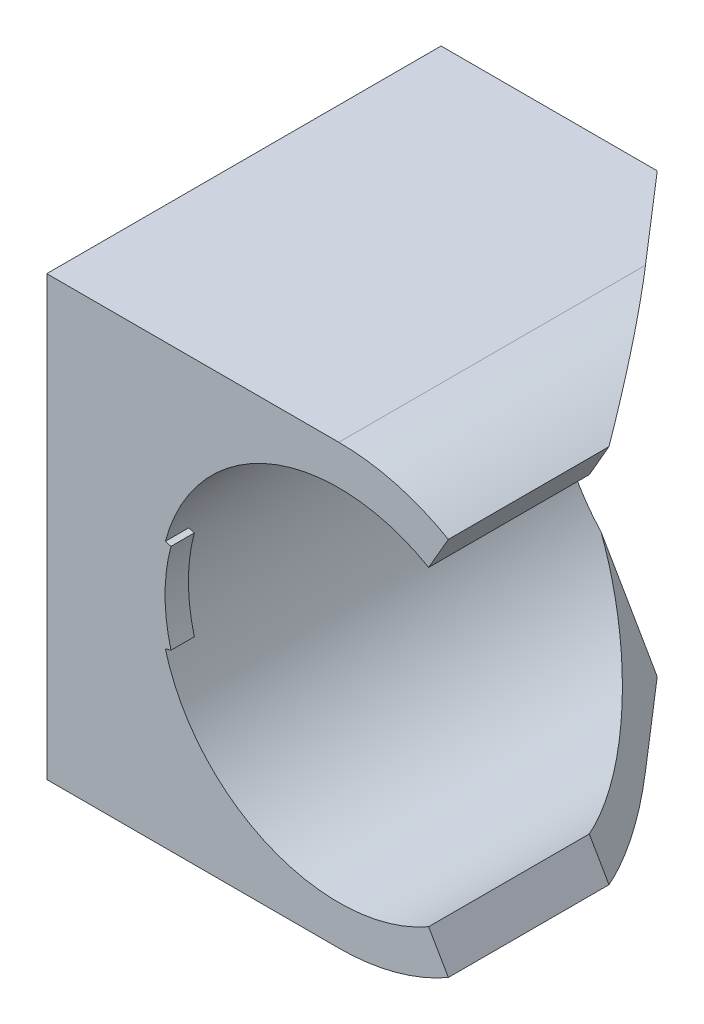
ISO-10303-21;
HEADER;
FILE_DESCRIPTION(('STEP AP214'),'2;1');
FILE_NAME('part.step','',(''),(''),'','','');
FILE_SCHEMA(('AUTOMOTIVE_DESIGN { 1 0 10303 214 1 1 1 1 }'));
ENDSEC;
DATA;
#1=APPLICATION_CONTEXT('core data for automotive mechanical design processes');
#2=APPLICATION_PROTOCOL_DEFINITION('international standard','automotive_design',2000,#1);
#3=PRODUCT_CONTEXT('',#1,'mechanical');
#4=PRODUCT('Part','Part','',(#3));
#5=PRODUCT_RELATED_PRODUCT_CATEGORY('part','',(#4));
#6=PRODUCT_DEFINITION_FORMATION('','',#4);
#7=PRODUCT_DEFINITION_CONTEXT('part definition',#1,'design');
#8=PRODUCT_DEFINITION('design','',#6,#7);
#9=PRODUCT_DEFINITION_SHAPE('','',#8);
#10=(LENGTH_UNIT() NAMED_UNIT(*) SI_UNIT(.MILLI.,.METRE.));
#11=(NAMED_UNIT(*) PLANE_ANGLE_UNIT() SI_UNIT($,.RADIAN.));
#12=(NAMED_UNIT(*) SI_UNIT($,.STERADIAN.) SOLID_ANGLE_UNIT());
#13=UNCERTAINTY_MEASURE_WITH_UNIT(LENGTH_MEASURE(1.E-05),#10,'distance_accuracy_value','');
#14=(GEOMETRIC_REPRESENTATION_CONTEXT(3) GLOBAL_UNCERTAINTY_ASSIGNED_CONTEXT((#13)) GLOBAL_UNIT_ASSIGNED_CONTEXT((#10,
#11,#12)) REPRESENTATION_CONTEXT('',''));
#15=CARTESIAN_POINT('',(0.,0.,0.));
#16=DIRECTION('',(0.,0.,1.));
#17=DIRECTION('',(1.,0.,0.));
#18=AXIS2_PLACEMENT_3D('',#15,#16,#17);
#19=CARTESIAN_POINT('',(0.,0.,13.5));
#20=DIRECTION('',(0.,0.,-1.));
#21=DIRECTION('',(-1.,0.,0.));
#22=AXIS2_PLACEMENT_3D('',#19,#20,#21);
#23=CYLINDRICAL_SURFACE('',#22,6.15);
#24=CARTESIAN_POINT('',(0.,0.,0.));
#25=DIRECTION('',(0.,0.,-1.));
#26=DIRECTION('',(1.,0.,0.));
#27=AXIS2_PLACEMENT_3D('',#24,#25,#26);
#28=CIRCLE('',#27,6.15);
#29=CARTESIAN_POINT('',(-5.94044383167777,1.59173712738051,0.));
#30=VERTEX_POINT('',#29);
#31=CARTESIAN_POINT('',(-4.52115242270667,4.16913429510895,0.));
#32=VERTEX_POINT('',#31);
#33=EDGE_CURVE('E256',#30,#32,#28,.T.);
#34=ORIENTED_EDGE('',*,*,#33,.T.);
#35=CARTESIAN_POINT('',(0.,0.,8.));
#36=DIRECTION('',(-0.692820323027555,0.399999999999993,0.6));
#37=DIRECTION('',(-0.519615242270666,0.299999999999995,-0.8));
#38=AXIS2_PLACEMENT_3D('',#35,#36,#37);
#39=ELLIPSE('',#38,10.25,6.15);
#40=CARTESIAN_POINT('',(3.07499999999995,5.32605623327433,8.));
#41=VERTEX_POINT('',#40);
#42=EDGE_CURVE('E318',#32,#41,#39,.F.);
#43=ORIENTED_EDGE('',*,*,#42,.T.);
#44=DIRECTION('',(0.,0.,-1.));
#45=VECTOR('',#44,1.);
#46=CARTESIAN_POINT('',(3.07499999999995,5.32605623327433,13.5));
#47=LINE('',#46,#45);
#48=CARTESIAN_POINT('',(3.07499999999995,5.32605623327433,13.5));
#49=VERTEX_POINT('',#48);
#50=EDGE_CURVE('E302',#49,#41,#47,.T.);
#51=ORIENTED_EDGE('',*,*,#50,.F.);
#52=CARTESIAN_POINT('',(0.,0.,13.5));
#53=DIRECTION('',(0.,0.,-1.));
#54=DIRECTION('',(1.,0.,0.));
#55=AXIS2_PLACEMENT_3D('',#52,#53,#54);
#56=CIRCLE('',#55,6.15);
#57=CARTESIAN_POINT('',(-5.94044383167777,1.59173712738051,13.5));
#58=VERTEX_POINT('',#57);
#59=EDGE_CURVE('E261',#58,#49,#56,.T.);
#60=ORIENTED_EDGE('',*,*,#59,.F.);
#61=DIRECTION('',(0.,0.,1.));
#62=VECTOR('',#61,1.);
#63=CARTESIAN_POINT('',(-5.94044383167777,1.59173712738051,13.5));
#64=LINE('',#63,#62);
#65=CARTESIAN_POINT('',(-5.94044383167777,1.59173712738051,12.7));
#66=VERTEX_POINT('',#65);
#67=EDGE_CURVE('E199',#66,#58,#64,.T.);
#68=ORIENTED_EDGE('',*,*,#67,.F.);
#69=CARTESIAN_POINT('',(0.,0.,12.7));
#70=DIRECTION('',(0.,0.,-1.));
#71=DIRECTION('',(-1.,0.,0.));
#72=AXIS2_PLACEMENT_3D('',#69,#70,#71);
#73=CIRCLE('',#72,6.15);
#74=CARTESIAN_POINT('',(-5.94044383167777,-1.59173712738051,12.7));
#75=VERTEX_POINT('',#74);
#76=EDGE_CURVE('E225',#75,#66,#73,.T.);
#77=ORIENTED_EDGE('',*,*,#76,.F.);
#78=DIRECTION('',(0.,0.,1.));
#79=VECTOR('',#78,1.);
#80=CARTESIAN_POINT('',(-5.94044383167777,-1.59173712738051,13.5));
#81=LINE('',#80,#79);
#82=CARTESIAN_POINT('',(-5.94044383167777,-1.59173712738051,13.5));
#83=VERTEX_POINT('',#82);
#84=EDGE_CURVE('E210',#75,#83,#81,.T.);
#85=ORIENTED_EDGE('',*,*,#84,.T.);
#86=CARTESIAN_POINT('',(3.07500000000003,-5.32605623327428,13.5));
#87=VERTEX_POINT('',#86);
#88=EDGE_CURVE('E257',#87,#83,#56,.T.);
#89=ORIENTED_EDGE('',*,*,#88,.F.);
#90=DIRECTION('',(0.,0.,-1.));
#91=VECTOR('',#90,1.);
#92=CARTESIAN_POINT('',(3.07500000000003,-5.32605623327428,13.5));
#93=LINE('',#92,#91);
#94=CARTESIAN_POINT('',(3.07500000000003,-5.32605623327428,8.));
#95=VERTEX_POINT('',#94);
#96=EDGE_CURVE('E275',#87,#95,#93,.T.);
#97=ORIENTED_EDGE('',*,*,#96,.T.);
#98=CARTESIAN_POINT('',(0.,0.,8.));
#99=DIRECTION('',(-0.692820323027549,-0.400000000000003,0.6));
#100=DIRECTION('',(-0.519615242270662,-0.300000000000003,-0.8));
#101=AXIS2_PLACEMENT_3D('',#98,#99,#100);
#102=ELLIPSE('',#101,10.25,6.15);
#103=CARTESIAN_POINT('',(-4.52115242270661,-4.16913429510901,0.));
#104=VERTEX_POINT('',#103);
#105=EDGE_CURVE('E316',#95,#104,#102,.F.);
#106=ORIENTED_EDGE('',*,*,#105,.T.);
#107=CARTESIAN_POINT('',(-5.94044383167777,-1.59173712738051,0.));
#108=VERTEX_POINT('',#107);
#109=EDGE_CURVE('E276',#104,#108,#28,.T.);
#110=ORIENTED_EDGE('',*,*,#109,.T.);
#111=DIRECTION('',(0.,0.,1.));
#112=VECTOR('',#111,1.);
#113=CARTESIAN_POINT('',(-5.94044383167777,-1.59173712738051,0.));
#114=LINE('',#113,#112);
#115=CARTESIAN_POINT('',(-5.94044383167777,-1.59173712738051,0.8));
#116=VERTEX_POINT('',#115);
#117=EDGE_CURVE('E239',#108,#116,#114,.T.);
#118=ORIENTED_EDGE('',*,*,#117,.T.);
#119=CARTESIAN_POINT('',(0.,0.,0.8));
#120=DIRECTION('',(0.,0.,-1.));
#121=DIRECTION('',(-1.,0.,0.));
#122=AXIS2_PLACEMENT_3D('',#119,#120,#121);
#123=CIRCLE('',#122,6.15);
#124=CARTESIAN_POINT('',(-5.94044383167777,1.59173712738051,0.8));
#125=VERTEX_POINT('',#124);
#126=EDGE_CURVE('E254',#116,#125,#123,.T.);
#127=ORIENTED_EDGE('',*,*,#126,.T.);
#128=DIRECTION('',(0.,0.,1.));
#129=VECTOR('',#128,1.);
#130=CARTESIAN_POINT('',(-5.94044383167777,1.59173712738051,0.));
#131=LINE('',#130,#129);
#132=EDGE_CURVE('E227',#30,#125,#131,.T.);
#133=ORIENTED_EDGE('',*,*,#132,.F.);
#134=EDGE_LOOP('',(#34,#43,#51,#60,#68,#77,#85,#89,#97,#106,#110,#118,#127,#133));
#135=FACE_BOUND('',#134,.T.);
#136=ADVANCED_FACE('F31',(#135),#23,.F.);
#137=CARTESIAN_POINT('',(3.07499999999995,5.32605623327433,13.5));
#138=DIRECTION('',(-0.866025403784444,0.499999999999991,0.));
#139=DIRECTION('',(-0.499999999999991,-0.866025403784444,0.));
#140=AXIS2_PLACEMENT_3D('',#137,#138,#139);
#141=PLANE('',#140);
#142=ORIENTED_EDGE('',*,*,#50,.T.);
#143=DIRECTION('',(0.499999999999991,0.866025403784444,0.));
#144=VECTOR('',#143,1.);
#145=CARTESIAN_POINT('',(3.07499999999995,5.32605623327433,8.));
#146=LINE('',#145,#144);
#147=CARTESIAN_POINT('',(3.74999999999994,6.49519052838333,8.));
#148=VERTEX_POINT('',#147);
#149=EDGE_CURVE('E305',#41,#148,#146,.T.);
#150=ORIENTED_EDGE('',*,*,#149,.T.);
#151=DIRECTION('',(0.,0.,-1.));
#152=VECTOR('',#151,1.);
#153=CARTESIAN_POINT('',(3.74999999999994,6.49519052838333,13.5));
#154=LINE('',#153,#152);
#155=CARTESIAN_POINT('',(3.74999999999994,6.49519052838333,13.5));
#156=VERTEX_POINT('',#155);
#157=EDGE_CURVE('E299',#156,#148,#154,.T.);
#158=ORIENTED_EDGE('',*,*,#157,.F.);
#159=DIRECTION('',(0.499999999999991,0.866025403784444,0.));
#160=VECTOR('',#159,1.);
#161=CARTESIAN_POINT('',(3.07499999999995,5.32605623327433,13.5));
#162=LINE('',#161,#160);
#163=EDGE_CURVE('E260',#49,#156,#162,.T.);
#164=ORIENTED_EDGE('',*,*,#163,.F.);
#165=EDGE_LOOP('',(#142,#150,#158,#164));
#166=FACE_BOUND('',#165,.T.);
#167=ADVANCED_FACE('F351',(#166),#141,.F.);
#168=CARTESIAN_POINT('',(0.,0.,13.5));
#169=DIRECTION('',(0.,0.,-1.));
#170=DIRECTION('',(-1.,0.,0.));
#171=AXIS2_PLACEMENT_3D('',#168,#169,#170);
#172=CYLINDRICAL_SURFACE('',#171,7.5);
#173=ORIENTED_EDGE('',*,*,#157,.T.);
#174=CARTESIAN_POINT('',(0.,0.,8.));
#175=DIRECTION('',(-0.692820323027555,0.399999999999993,0.6));
#176=DIRECTION('',(-0.519615242270666,0.299999999999995,-0.8));
#177=AXIS2_PLACEMENT_3D('',#174,#175,#176);
#178=ELLIPSE('',#177,12.5,7.5);
#179=CARTESIAN_POINT('',(0.,7.5,3.00000000000009));
#180=VERTEX_POINT('',#179);
#181=EDGE_CURVE('E308',#148,#180,#178,.T.);
#182=ORIENTED_EDGE('',*,*,#181,.T.);
#183=DIRECTION('',(0.,0.,-1.));
#184=VECTOR('',#183,1.);
#185=CARTESIAN_POINT('',(0.,7.5,13.5));
#186=LINE('',#185,#184);
#187=CARTESIAN_POINT('',(0.,7.5,13.5));
#188=VERTEX_POINT('',#187);
#189=EDGE_CURVE('E296',#188,#180,#186,.T.);
#190=ORIENTED_EDGE('',*,*,#189,.F.);
#191=CARTESIAN_POINT('',(0.,0.,13.5));
#192=DIRECTION('',(0.,0.,1.));
#193=DIRECTION('',(1.,0.,0.));
#194=AXIS2_PLACEMENT_3D('',#191,#192,#193);
#195=CIRCLE('',#194,7.5);
#196=EDGE_CURVE('E263',#156,#188,#195,.T.);
#197=ORIENTED_EDGE('',*,*,#196,.F.);
#198=EDGE_LOOP('',(#173,#182,#190,#197));
#199=FACE_BOUND('',#198,.T.);
#200=ADVANCED_FACE('F356',(#199),#172,.T.);
#201=CARTESIAN_POINT('',(0.,7.5,13.5));
#202=DIRECTION('',(0.,-1.,0.));
#203=DIRECTION('',(1.,0.,0.));
#204=AXIS2_PLACEMENT_3D('',#201,#202,#203);
#205=PLANE('',#204);
#206=ORIENTED_EDGE('',*,*,#189,.T.);
#207=DIRECTION('',(0.654653670707975,0.,0.755928946018456));
#208=VECTOR('',#207,1.);
#209=CARTESIAN_POINT('',(3.79221543938403,7.5,7.37887320950697));
#210=LINE('',#209,#208);
#211=CARTESIAN_POINT('',(-2.59807621135338,7.5,0.));
#212=VERTEX_POINT('',#211);
#213=EDGE_CURVE('E310',#180,#212,#210,.F.);
#214=ORIENTED_EDGE('',*,*,#213,.T.);
#215=DIRECTION('',(-1.,0.,0.));
#216=VECTOR('',#215,1.);
#217=CARTESIAN_POINT('',(0.,7.5,0.));
#218=LINE('',#217,#216);
#219=CARTESIAN_POINT('',(-10.,7.5,0.));
#220=VERTEX_POINT('',#219);
#221=EDGE_CURVE('E278',#212,#220,#218,.T.);
#222=ORIENTED_EDGE('',*,*,#221,.T.);
#223=DIRECTION('',(0.,0.,-1.));
#224=VECTOR('',#223,1.);
#225=CARTESIAN_POINT('',(-10.,7.5,13.5));
#226=LINE('',#225,#224);
#227=CARTESIAN_POINT('',(-10.,7.5,13.5));
#228=VERTEX_POINT('',#227);
#229=EDGE_CURVE('E293',#228,#220,#226,.T.);
#230=ORIENTED_EDGE('',*,*,#229,.F.);
#231=DIRECTION('',(-1.,0.,0.));
#232=VECTOR('',#231,1.);
#233=CARTESIAN_POINT('',(0.,7.5,13.5));
#234=LINE('',#233,#232);
#235=EDGE_CURVE('E265',#188,#228,#234,.T.);
#236=ORIENTED_EDGE('',*,*,#235,.F.);
#237=EDGE_LOOP('',(#206,#214,#222,#230,#236));
#238=FACE_BOUND('',#237,.T.);
#239=ADVANCED_FACE('F430',(#238),#205,.F.);
#240=CARTESIAN_POINT('',(-10.,7.5,13.5));
#241=DIRECTION('',(1.,0.,0.));
#242=DIRECTION('',(0.,0.,-1.));
#243=AXIS2_PLACEMENT_3D('',#240,#241,#242);
#244=PLANE('',#243);
#245=CARTESIAN_POINT('',(-10.,-5.,2.5));
#246=DIRECTION('',(-1.,0.,0.));
#247=DIRECTION('',(0.,0.,1.));
#248=AXIS2_PLACEMENT_3D('',#245,#246,#247);
#249=CIRCLE('',#248,1.35);
#250=CARTESIAN_POINT('',(-10.,-5.,3.85));
#251=VERTEX_POINT('',#250);
#252=EDGE_CURVE('E177',#251,#251,#249,.T.);
#253=ORIENTED_EDGE('',*,*,#252,.F.);
#254=EDGE_LOOP('',(#253));
#255=FACE_BOUND('',#254,.T.);
#256=CARTESIAN_POINT('',(-10.,5.,2.5));
#257=DIRECTION('',(-1.,0.,0.));
#258=DIRECTION('',(0.,0.,1.));
#259=AXIS2_PLACEMENT_3D('',#256,#257,#258);
#260=CIRCLE('',#259,1.35);
#261=CARTESIAN_POINT('',(-10.,5.,3.85));
#262=VERTEX_POINT('',#261);
#263=EDGE_CURVE('E176',#262,#262,#260,.T.);
#264=ORIENTED_EDGE('',*,*,#263,.F.);
#265=EDGE_LOOP('',(#264));
#266=FACE_BOUND('',#265,.T.);
#267=CARTESIAN_POINT('',(-10.,5.,11.));
#268=DIRECTION('',(-1.,0.,0.));
#269=DIRECTION('',(0.,0.,1.));
#270=AXIS2_PLACEMENT_3D('',#267,#268,#269);
#271=CIRCLE('',#270,1.35);
#272=CARTESIAN_POINT('',(-10.,5.,12.35));
#273=VERTEX_POINT('',#272);
#274=EDGE_CURVE('E187',#273,#273,#271,.T.);
#275=ORIENTED_EDGE('',*,*,#274,.F.);
#276=EDGE_LOOP('',(#275));
#277=FACE_BOUND('',#276,.T.);
#278=CARTESIAN_POINT('',(-10.,-5.,11.));
#279=DIRECTION('',(-1.,0.,0.));
#280=DIRECTION('',(0.,0.,1.));
#281=AXIS2_PLACEMENT_3D('',#278,#279,#280);
#282=CIRCLE('',#281,1.35);
#283=CARTESIAN_POINT('',(-10.,-5.,12.35));
#284=VERTEX_POINT('',#283);
#285=EDGE_CURVE('E193',#284,#284,#282,.T.);
#286=ORIENTED_EDGE('',*,*,#285,.F.);
#287=EDGE_LOOP('',(#286));
#288=FACE_BOUND('',#287,.T.);
#289=DIRECTION('',(0.,-1.,0.));
#290=VECTOR('',#289,1.);
#291=CARTESIAN_POINT('',(-10.,7.5,0.));
#292=LINE('',#291,#290);
#293=CARTESIAN_POINT('',(-10.,-7.5,0.));
#294=VERTEX_POINT('',#293);
#295=EDGE_CURVE('E280',#220,#294,#292,.T.);
#296=ORIENTED_EDGE('',*,*,#295,.T.);
#297=DIRECTION('',(0.,0.,-1.));
#298=VECTOR('',#297,1.);
#299=CARTESIAN_POINT('',(-10.,-7.5,13.5));
#300=LINE('',#299,#298);
#301=CARTESIAN_POINT('',(-10.,-7.5,13.5));
#302=VERTEX_POINT('',#301);
#303=EDGE_CURVE('E290',#302,#294,#300,.T.);
#304=ORIENTED_EDGE('',*,*,#303,.F.);
#305=DIRECTION('',(0.,-1.,0.));
#306=VECTOR('',#305,1.);
#307=CARTESIAN_POINT('',(-10.,7.5,13.5));
#308=LINE('',#307,#306);
#309=EDGE_CURVE('E267',#228,#302,#308,.T.);
#310=ORIENTED_EDGE('',*,*,#309,.F.);
#311=ORIENTED_EDGE('',*,*,#229,.T.);
#312=EDGE_LOOP('',(#296,#304,#310,#311));
#313=FACE_BOUND('',#312,.T.);
#314=ADVANCED_FACE('F348',(#255,#266,#277,#288,#313),#244,.F.);
#315=CARTESIAN_POINT('',(0.,-7.5,13.5));
#316=DIRECTION('',(0.,1.,0.));
#317=DIRECTION('',(-1.,0.,0.));
#318=AXIS2_PLACEMENT_3D('',#315,#316,#317);
#319=PLANE('',#318);
#320=DIRECTION('',(1.,0.,0.));
#321=VECTOR('',#320,1.);
#322=CARTESIAN_POINT('',(0.,-7.5,0.));
#323=LINE('',#322,#321);
#324=CARTESIAN_POINT('',(-2.59807621135329,-7.5,0.));
#325=VERTEX_POINT('',#324);
#326=EDGE_CURVE('E282',#294,#325,#323,.T.);
#327=ORIENTED_EDGE('',*,*,#326,.T.);
#328=DIRECTION('',(-0.654653670707978,0.,-0.755928946018453));
#329=VECTOR('',#328,1.);
#330=CARTESIAN_POINT('',(3.79221543938415,-7.5,7.37887320950693));
#331=LINE('',#330,#329);
#332=CARTESIAN_POINT('',(0.,-7.5,2.99999999999996));
#333=VERTEX_POINT('',#332);
#334=EDGE_CURVE('E39',#325,#333,#331,.F.);
#335=ORIENTED_EDGE('',*,*,#334,.T.);
#336=DIRECTION('',(0.,0.,-1.));
#337=VECTOR('',#336,1.);
#338=CARTESIAN_POINT('',(0.,-7.5,13.5));
#339=LINE('',#338,#337);
#340=CARTESIAN_POINT('',(0.,-7.5,13.5));
#341=VERTEX_POINT('',#340);
#342=EDGE_CURVE('E288',#341,#333,#339,.T.);
#343=ORIENTED_EDGE('',*,*,#342,.F.);
#344=DIRECTION('',(1.,0.,0.));
#345=VECTOR('',#344,1.);
#346=CARTESIAN_POINT('',(0.,-7.5,13.5));
#347=LINE('',#346,#345);
#348=EDGE_CURVE('E269',#302,#341,#347,.T.);
#349=ORIENTED_EDGE('',*,*,#348,.F.);
#350=ORIENTED_EDGE('',*,*,#303,.T.);
#351=EDGE_LOOP('',(#327,#335,#343,#349,#350));
#352=FACE_BOUND('',#351,.T.);
#353=ADVANCED_FACE('F341',(#352),#319,.F.);
#354=CARTESIAN_POINT('',(0.,0.,13.5));
#355=DIRECTION('',(0.,0.,-1.));
#356=DIRECTION('',(-1.,0.,0.));
#357=AXIS2_PLACEMENT_3D('',#354,#355,#356);
#358=CYLINDRICAL_SURFACE('',#357,7.5);
#359=ORIENTED_EDGE('',*,*,#342,.T.);
#360=CARTESIAN_POINT('',(0.,0.,8.));
#361=DIRECTION('',(-0.692820323027549,-0.400000000000003,0.6));
#362=DIRECTION('',(-0.519615242270662,-0.300000000000003,-0.8));
#363=AXIS2_PLACEMENT_3D('',#360,#361,#362);
#364=ELLIPSE('',#363,12.5,7.5);
#365=CARTESIAN_POINT('',(3.75000000000003,-6.49519052838327,8.));
#366=VERTEX_POINT('',#365);
#367=EDGE_CURVE('E11',#333,#366,#364,.T.);
#368=ORIENTED_EDGE('',*,*,#367,.T.);
#369=DIRECTION('',(0.,0.,-1.));
#370=VECTOR('',#369,1.);
#371=CARTESIAN_POINT('',(3.75000000000003,-6.49519052838327,13.5));
#372=LINE('',#371,#370);
#373=CARTESIAN_POINT('',(3.75000000000003,-6.49519052838327,13.5));
#374=VERTEX_POINT('',#373);
#375=EDGE_CURVE('E286',#374,#366,#372,.T.);
#376=ORIENTED_EDGE('',*,*,#375,.F.);
#377=CARTESIAN_POINT('',(0.,0.,13.5));
#378=DIRECTION('',(0.,0.,1.));
#379=DIRECTION('',(1.,0.,0.));
#380=AXIS2_PLACEMENT_3D('',#377,#378,#379);
#381=CIRCLE('',#380,7.5);
#382=EDGE_CURVE('E271',#341,#374,#381,.T.);
#383=ORIENTED_EDGE('',*,*,#382,.F.);
#384=EDGE_LOOP('',(#359,#368,#376,#383));
#385=FACE_BOUND('',#384,.T.);
#386=ADVANCED_FACE('F339',(#385),#358,.T.);
#387=CARTESIAN_POINT('',(3.07500000000003,-5.32605623327428,13.5));
#388=DIRECTION('',(-0.866025403784436,-0.500000000000004,0.));
#389=DIRECTION('',(0.500000000000004,-0.866025403784436,0.));
#390=AXIS2_PLACEMENT_3D('',#387,#388,#389);
#391=PLANE('',#390);
#392=ORIENTED_EDGE('',*,*,#375,.T.);
#393=DIRECTION('',(-0.500000000000004,0.866025403784436,0.));
#394=VECTOR('',#393,1.);
#395=CARTESIAN_POINT('',(3.07500000000003,-5.32605623327428,8.));
#396=LINE('',#395,#394);
#397=EDGE_CURVE('E320',#366,#95,#396,.T.);
#398=ORIENTED_EDGE('',*,*,#397,.T.);
#399=ORIENTED_EDGE('',*,*,#96,.F.);
#400=DIRECTION('',(-0.500000000000004,0.866025403784436,0.));
#401=VECTOR('',#400,1.);
#402=CARTESIAN_POINT('',(3.07500000000003,-5.32605623327428,13.5));
#403=LINE('',#402,#401);
#404=EDGE_CURVE('E273',#374,#87,#403,.T.);
#405=ORIENTED_EDGE('',*,*,#404,.F.);
#406=EDGE_LOOP('',(#392,#398,#399,#405));
#407=FACE_BOUND('',#406,.T.);
#408=ADVANCED_FACE('F325',(#407),#391,.F.);
#409=CARTESIAN_POINT('',(0.,0.,13.5));
#410=DIRECTION('',(0.,0.,1.));
#411=DIRECTION('',(1.,0.,0.));
#412=AXIS2_PLACEMENT_3D('',#409,#410,#411);
#413=PLANE('',#412);
#414=ORIENTED_EDGE('',*,*,#88,.T.);
#415=DIRECTION('',(0.965925826289068,0.258819045102521,0.));
#416=VECTOR('',#415,1.);
#417=CARTESIAN_POINT('',(-5.94044383167777,-1.59173712738051,13.5));
#418=LINE('',#417,#416);
#419=CARTESIAN_POINT('',(-5.74725866641995,-1.53997331836,13.5));
#420=VERTEX_POINT('',#419);
#421=EDGE_CURVE('E213',#83,#420,#418,.T.);
#422=ORIENTED_EDGE('',*,*,#421,.T.);
#423=CARTESIAN_POINT('',(0.,0.,13.5));
#424=DIRECTION('',(0.,0.,-1.));
#425=DIRECTION('',(-1.,0.,0.));
#426=AXIS2_PLACEMENT_3D('',#423,#424,#425);
#427=CIRCLE('',#426,5.95);
#428=CARTESIAN_POINT('',(-5.74725866641995,1.53997331836,13.5));
#429=VERTEX_POINT('',#428);
#430=EDGE_CURVE('E221',#420,#429,#427,.T.);
#431=ORIENTED_EDGE('',*,*,#430,.T.);
#432=DIRECTION('',(0.965925826289068,-0.258819045102521,0.));
#433=VECTOR('',#432,1.);
#434=CARTESIAN_POINT('',(-5.94044383167777,1.59173712738051,13.5));
#435=LINE('',#434,#433);
#436=EDGE_CURVE('E201',#58,#429,#435,.T.);
#437=ORIENTED_EDGE('',*,*,#436,.F.);
#438=ORIENTED_EDGE('',*,*,#59,.T.);
#439=ORIENTED_EDGE('',*,*,#163,.T.);
#440=ORIENTED_EDGE('',*,*,#196,.T.);
#441=ORIENTED_EDGE('',*,*,#235,.T.);
#442=ORIENTED_EDGE('',*,*,#309,.T.);
#443=ORIENTED_EDGE('',*,*,#348,.T.);
#444=ORIENTED_EDGE('',*,*,#382,.T.);
#445=ORIENTED_EDGE('',*,*,#404,.T.);
#446=EDGE_LOOP('',(#414,#422,#431,#437,#438,#439,#440,#441,#442,#443,#444,#445));
#447=FACE_BOUND('',#446,.T.);
#448=ADVANCED_FACE('F335',(#447),#413,.T.);
#449=CARTESIAN_POINT('',(0.,0.,0.));
#450=DIRECTION('',(0.,0.,1.));
#451=DIRECTION('',(1.,0.,0.));
#452=AXIS2_PLACEMENT_3D('',#449,#450,#451);
#453=PLANE('',#452);
#454=ORIENTED_EDGE('',*,*,#221,.F.);
#455=DIRECTION('',(-0.499999999999991,-0.866025403784444,0.));
#456=VECTOR('',#455,1.);
#457=CARTESIAN_POINT('',(-5.19615242270666,2.99999999999995,0.));
#458=LINE('',#457,#456);
#459=EDGE_CURVE('E314',#212,#32,#458,.T.);
#460=ORIENTED_EDGE('',*,*,#459,.T.);
#461=ORIENTED_EDGE('',*,*,#33,.F.);
#462=DIRECTION('',(-0.965925826289068,0.258819045102521,0.));
#463=VECTOR('',#462,1.);
#464=CARTESIAN_POINT('',(-5.94044383167777,1.59173712738051,0.));
#465=LINE('',#464,#463);
#466=CARTESIAN_POINT('',(-5.74725866641996,1.53997331836,0.));
#467=VERTEX_POINT('',#466);
#468=EDGE_CURVE('E236',#467,#30,#465,.T.);
#469=ORIENTED_EDGE('',*,*,#468,.F.);
#470=CARTESIAN_POINT('',(0.,0.,0.));
#471=DIRECTION('',(0.,0.,-1.));
#472=DIRECTION('',(-1.,0.,0.));
#473=AXIS2_PLACEMENT_3D('',#470,#471,#472);
#474=CIRCLE('',#473,5.95);
#475=CARTESIAN_POINT('',(-5.74725866641996,-1.53997331836,0.));
#476=VERTEX_POINT('',#475);
#477=EDGE_CURVE('E250',#476,#467,#474,.T.);
#478=ORIENTED_EDGE('',*,*,#477,.F.);
#479=DIRECTION('',(-0.965925826289068,-0.258819045102521,0.));
#480=VECTOR('',#479,1.);
#481=CARTESIAN_POINT('',(-5.94044383167777,-1.59173712738051,0.));
#482=LINE('',#481,#480);
#483=EDGE_CURVE('E247',#476,#108,#482,.T.);
#484=ORIENTED_EDGE('',*,*,#483,.T.);
#485=ORIENTED_EDGE('',*,*,#109,.F.);
#486=DIRECTION('',(0.500000000000004,-0.866025403784436,0.));
#487=VECTOR('',#486,1.);
#488=CARTESIAN_POINT('',(-5.19615242270662,-3.00000000000003,0.));
#489=LINE('',#488,#487);
#490=EDGE_CURVE('E312',#104,#325,#489,.T.);
#491=ORIENTED_EDGE('',*,*,#490,.T.);
#492=ORIENTED_EDGE('',*,*,#326,.F.);
#493=ORIENTED_EDGE('',*,*,#295,.F.);
#494=EDGE_LOOP('',(#454,#460,#461,#469,#478,#484,#485,#491,#492,#493));
#495=FACE_BOUND('',#494,.T.);
#496=ADVANCED_FACE('F417',(#495),#453,.F.);
#497=CARTESIAN_POINT('',(-5.94044383167777,-1.59173712738051,0.8));
#498=DIRECTION('',(0.,0.,1.));
#499=DIRECTION('',(1.,0.,0.));
#500=AXIS2_PLACEMENT_3D('',#497,#498,#499);
#501=PLANE('',#500);
#502=CARTESIAN_POINT('',(0.,0.,0.8));
#503=DIRECTION('',(0.,0.,-1.));
#504=DIRECTION('',(-1.,0.,0.));
#505=AXIS2_PLACEMENT_3D('',#502,#503,#504);
#506=CIRCLE('',#505,5.95);
#507=CARTESIAN_POINT('',(-5.74725866641996,-1.53997331836,0.8));
#508=VERTEX_POINT('',#507);
#509=CARTESIAN_POINT('',(-5.74725866641996,1.53997331836,0.8));
#510=VERTEX_POINT('',#509);
#511=EDGE_CURVE('E252',#508,#510,#506,.T.);
#512=ORIENTED_EDGE('',*,*,#511,.T.);
#513=DIRECTION('',(0.965925826289068,-0.258819045102521,0.));
#514=VECTOR('',#513,1.);
#515=CARTESIAN_POINT('',(-5.94044383167777,1.59173712738051,0.8));
#516=LINE('',#515,#514);
#517=EDGE_CURVE('E230',#125,#510,#516,.T.);
#518=ORIENTED_EDGE('',*,*,#517,.F.);
#519=ORIENTED_EDGE('',*,*,#126,.F.);
#520=DIRECTION('',(0.965925826289068,0.258819045102521,0.));
#521=VECTOR('',#520,1.);
#522=CARTESIAN_POINT('',(-5.94044383167777,-1.59173712738051,0.8));
#523=LINE('',#522,#521);
#524=EDGE_CURVE('E241',#116,#508,#523,.T.);
#525=ORIENTED_EDGE('',*,*,#524,.T.);
#526=EDGE_LOOP('',(#512,#518,#519,#525));
#527=FACE_BOUND('',#526,.T.);
#528=ADVANCED_FACE('F413',(#527),#501,.T.);
#529=CARTESIAN_POINT('',(0.,0.,0.));
#530=DIRECTION('',(0.,0.,-1.));
#531=DIRECTION('',(-1.,0.,0.));
#532=AXIS2_PLACEMENT_3D('',#529,#530,#531);
#533=CYLINDRICAL_SURFACE('',#532,5.95);
#534=ORIENTED_EDGE('',*,*,#477,.T.);
#535=DIRECTION('',(0.,0.,-1.));
#536=VECTOR('',#535,1.);
#537=CARTESIAN_POINT('',(-5.74725866641996,1.53997331836,0.));
#538=LINE('',#537,#536);
#539=EDGE_CURVE('E233',#510,#467,#538,.T.);
#540=ORIENTED_EDGE('',*,*,#539,.F.);
#541=ORIENTED_EDGE('',*,*,#511,.F.);
#542=DIRECTION('',(0.,0.,-1.));
#543=VECTOR('',#542,1.);
#544=CARTESIAN_POINT('',(-5.74725866641996,-1.53997331836,0.));
#545=LINE('',#544,#543);
#546=EDGE_CURVE('E244',#508,#476,#545,.T.);
#547=ORIENTED_EDGE('',*,*,#546,.T.);
#548=EDGE_LOOP('',(#534,#540,#541,#547));
#549=FACE_BOUND('',#548,.T.);
#550=ADVANCED_FACE('F409',(#549),#533,.F.);
#551=CARTESIAN_POINT('',(-5.94044383167777,-1.59173712738051,0.8));
#552=DIRECTION('',(-0.258819045102521,0.965925826289068,0.));
#553=DIRECTION('',(0.,0.,1.));
#554=AXIS2_PLACEMENT_3D('',#551,#552,#553);
#555=PLANE('',#554);
#556=ORIENTED_EDGE('',*,*,#117,.F.);
#557=ORIENTED_EDGE('',*,*,#483,.F.);
#558=ORIENTED_EDGE('',*,*,#546,.F.);
#559=ORIENTED_EDGE('',*,*,#524,.F.);
#560=EDGE_LOOP('',(#556,#557,#558,#559));
#561=FACE_BOUND('',#560,.T.);
#562=ADVANCED_FACE('F405',(#561),#555,.F.);
#563=CARTESIAN_POINT('',(-5.94044383167777,1.59173712738051,0.8));
#564=DIRECTION('',(0.258819045102521,0.965925826289068,0.));
#565=DIRECTION('',(0.,0.,1.));
#566=AXIS2_PLACEMENT_3D('',#563,#564,#565);
#567=PLANE('',#566);
#568=ORIENTED_EDGE('',*,*,#132,.T.);
#569=ORIENTED_EDGE('',*,*,#517,.T.);
#570=ORIENTED_EDGE('',*,*,#539,.T.);
#571=ORIENTED_EDGE('',*,*,#468,.T.);
#572=EDGE_LOOP('',(#568,#569,#570,#571));
#573=FACE_BOUND('',#572,.T.);
#574=ADVANCED_FACE('F400',(#573),#567,.T.);
#575=CARTESIAN_POINT('',(-5.94044383167777,-1.59173712738051,12.7));
#576=DIRECTION('',(0.,0.,-1.));
#577=DIRECTION('',(-1.,0.,0.));
#578=AXIS2_PLACEMENT_3D('',#575,#576,#577);
#579=PLANE('',#578);
#580=CARTESIAN_POINT('',(0.,0.,12.7));
#581=DIRECTION('',(0.,0.,-1.));
#582=DIRECTION('',(-1.,0.,0.));
#583=AXIS2_PLACEMENT_3D('',#580,#581,#582);
#584=CIRCLE('',#583,5.95);
#585=CARTESIAN_POINT('',(-5.74725866641995,-1.53997331836,12.7));
#586=VERTEX_POINT('',#585);
#587=CARTESIAN_POINT('',(-5.74725866641995,1.53997331836,12.7));
#588=VERTEX_POINT('',#587);
#589=EDGE_CURVE('E223',#586,#588,#584,.T.);
#590=ORIENTED_EDGE('',*,*,#589,.F.);
#591=DIRECTION('',(-0.965925826289068,-0.258819045102521,0.));
#592=VECTOR('',#591,1.);
#593=CARTESIAN_POINT('',(-5.94044383167777,-1.59173712738051,12.7));
#594=LINE('',#593,#592);
#595=EDGE_CURVE('E219',#586,#75,#594,.T.);
#596=ORIENTED_EDGE('',*,*,#595,.T.);
#597=ORIENTED_EDGE('',*,*,#76,.T.);
#598=DIRECTION('',(-0.965925826289068,0.258819045102521,0.));
#599=VECTOR('',#598,1.);
#600=CARTESIAN_POINT('',(-5.94044383167777,1.59173712738051,12.7));
#601=LINE('',#600,#599);
#602=EDGE_CURVE('E207',#588,#66,#601,.T.);
#603=ORIENTED_EDGE('',*,*,#602,.F.);
#604=EDGE_LOOP('',(#590,#596,#597,#603));
#605=FACE_BOUND('',#604,.T.);
#606=ADVANCED_FACE('F388',(#605),#579,.T.);
#607=CARTESIAN_POINT('',(0.,0.,0.));
#608=DIRECTION('',(0.,0.,-1.));
#609=DIRECTION('',(-1.,0.,0.));
#610=AXIS2_PLACEMENT_3D('',#607,#608,#609);
#611=CYLINDRICAL_SURFACE('',#610,5.95);
#612=ORIENTED_EDGE('',*,*,#430,.F.);
#613=DIRECTION('',(0.,0.,-1.));
#614=VECTOR('',#613,1.);
#615=CARTESIAN_POINT('',(-5.74725866641995,-1.53997331836,13.5));
#616=LINE('',#615,#614);
#617=EDGE_CURVE('E216',#420,#586,#616,.T.);
#618=ORIENTED_EDGE('',*,*,#617,.T.);
#619=ORIENTED_EDGE('',*,*,#589,.T.);
#620=DIRECTION('',(0.,0.,-1.));
#621=VECTOR('',#620,1.);
#622=CARTESIAN_POINT('',(-5.74725866641995,1.53997331836,13.5));
#623=LINE('',#622,#621);
#624=EDGE_CURVE('E204',#429,#588,#623,.T.);
#625=ORIENTED_EDGE('',*,*,#624,.F.);
#626=EDGE_LOOP('',(#612,#618,#619,#625));
#627=FACE_BOUND('',#626,.T.);
#628=ADVANCED_FACE('F392',(#627),#611,.F.);
#629=CARTESIAN_POINT('',(-5.94044383167777,-1.59173712738051,12.7));
#630=DIRECTION('',(0.258819045102521,-0.965925826289068,0.));
#631=DIRECTION('',(0.,0.,-1.));
#632=AXIS2_PLACEMENT_3D('',#629,#630,#631);
#633=PLANE('',#632);
#634=ORIENTED_EDGE('',*,*,#84,.F.);
#635=ORIENTED_EDGE('',*,*,#595,.F.);
#636=ORIENTED_EDGE('',*,*,#617,.F.);
#637=ORIENTED_EDGE('',*,*,#421,.F.);
#638=EDGE_LOOP('',(#634,#635,#636,#637));
#639=FACE_BOUND('',#638,.T.);
#640=ADVANCED_FACE('F369',(#639),#633,.T.);
#641=CARTESIAN_POINT('',(-5.94044383167777,1.59173712738051,12.7));
#642=DIRECTION('',(-0.258819045102521,-0.965925826289068,0.));
#643=DIRECTION('',(0.,0.,-1.));
#644=AXIS2_PLACEMENT_3D('',#641,#642,#643);
#645=PLANE('',#644);
#646=ORIENTED_EDGE('',*,*,#67,.T.);
#647=ORIENTED_EDGE('',*,*,#436,.T.);
#648=ORIENTED_EDGE('',*,*,#624,.T.);
#649=ORIENTED_EDGE('',*,*,#602,.T.);
#650=EDGE_LOOP('',(#646,#647,#648,#649));
#651=FACE_BOUND('',#650,.T.);
#652=ADVANCED_FACE('F362',(#651),#645,.F.);
#653=CARTESIAN_POINT('',(3.07499999999995,5.32605623327433,8.));
#654=DIRECTION('',(-0.692820323027555,0.399999999999993,0.6));
#655=DIRECTION('',(0.654653670707975,0.,0.755928946018456));
#656=AXIS2_PLACEMENT_3D('',#653,#654,#655);
#657=PLANE('',#656);
#658=ORIENTED_EDGE('',*,*,#42,.F.);
#659=ORIENTED_EDGE('',*,*,#459,.F.);
#660=ORIENTED_EDGE('',*,*,#213,.F.);
#661=ORIENTED_EDGE('',*,*,#181,.F.);
#662=ORIENTED_EDGE('',*,*,#149,.F.);
#663=EDGE_LOOP('',(#658,#659,#660,#661,#662));
#664=FACE_BOUND('',#663,.T.);
#665=ADVANCED_FACE('F360',(#664),#657,.F.);
#666=CARTESIAN_POINT('',(3.07500000000003,-5.32605623327428,8.));
#667=DIRECTION('',(-0.692820323027549,-0.400000000000003,0.6));
#668=DIRECTION('',(0.654653670707978,0.,0.755928946018453));
#669=AXIS2_PLACEMENT_3D('',#666,#667,#668);
#670=PLANE('',#669);
#671=ORIENTED_EDGE('',*,*,#334,.F.);
#672=ORIENTED_EDGE('',*,*,#490,.F.);
#673=ORIENTED_EDGE('',*,*,#105,.F.);
#674=ORIENTED_EDGE('',*,*,#397,.F.);
#675=ORIENTED_EDGE('',*,*,#367,.F.);
#676=EDGE_LOOP('',(#671,#672,#673,#674,#675));
#677=FACE_BOUND('',#676,.T.);
#678=ADVANCED_FACE('F33',(#677),#670,.F.);
#679=CARTESIAN_POINT('',(-6.,-5.,11.));
#680=DIRECTION('',(-1.,0.,0.));
#681=DIRECTION('',(0.,0.,1.));
#682=AXIS2_PLACEMENT_3D('',#679,#680,#681);
#683=CONICAL_SURFACE('',#682,1.35,1.02974425867665);
#684=CARTESIAN_POINT('',(-5.18883816431279,-5.,11.));
#685=VERTEX_POINT('',#684);
#686=VERTEX_LOOP('',#685);
#687=FACE_BOUND('',#686,.T.);
#688=CARTESIAN_POINT('',(-6.,-5.,11.));
#689=DIRECTION('',(-1.,0.,0.));
#690=DIRECTION('',(0.,0.,1.));
#691=AXIS2_PLACEMENT_3D('',#688,#689,#690);
#692=CIRCLE('',#691,1.35);
#693=CARTESIAN_POINT('',(-6.,-5.,12.35));
#694=VERTEX_POINT('',#693);
#695=EDGE_CURVE('E196',#694,#694,#692,.T.);
#696=ORIENTED_EDGE('',*,*,#695,.T.);
#697=EDGE_LOOP('',(#696));
#698=FACE_BOUND('',#697,.T.);
#699=ADVANCED_FACE('F368',(#687,#698),#683,.F.);
#700=CARTESIAN_POINT('',(-10.,-5.,11.));
#701=DIRECTION('',(-1.,0.,0.));
#702=DIRECTION('',(0.,0.,1.));
#703=AXIS2_PLACEMENT_3D('',#700,#701,#702);
#704=CYLINDRICAL_SURFACE('',#703,1.35);
#705=ORIENTED_EDGE('',*,*,#695,.F.);
#706=EDGE_LOOP('',(#705));
#707=FACE_BOUND('',#706,.T.);
#708=ORIENTED_EDGE('',*,*,#285,.T.);
#709=EDGE_LOOP('',(#708));
#710=FACE_BOUND('',#709,.T.);
#711=ADVANCED_FACE('F454',(#707,#710),#704,.F.);
#712=CARTESIAN_POINT('',(-6.,5.,11.));
#713=DIRECTION('',(-1.,0.,0.));
#714=DIRECTION('',(0.,0.,1.));
#715=AXIS2_PLACEMENT_3D('',#712,#713,#714);
#716=CONICAL_SURFACE('',#715,1.35,1.02974425867665);
#717=CARTESIAN_POINT('',(-5.18883816431279,5.,11.));
#718=VERTEX_POINT('',#717);
#719=VERTEX_LOOP('',#718);
#720=FACE_BOUND('',#719,.T.);
#721=CARTESIAN_POINT('',(-6.,5.,11.));
#722=DIRECTION('',(-1.,0.,0.));
#723=DIRECTION('',(0.,0.,1.));
#724=AXIS2_PLACEMENT_3D('',#721,#722,#723);
#725=CIRCLE('',#724,1.35);
#726=CARTESIAN_POINT('',(-6.,5.,12.35));
#727=VERTEX_POINT('',#726);
#728=EDGE_CURVE('E190',#727,#727,#725,.T.);
#729=ORIENTED_EDGE('',*,*,#728,.T.);
#730=EDGE_LOOP('',(#729));
#731=FACE_BOUND('',#730,.T.);
#732=ADVANCED_FACE('F456',(#720,#731),#716,.F.);
#733=CARTESIAN_POINT('',(-10.,5.,11.));
#734=DIRECTION('',(-1.,0.,0.));
#735=DIRECTION('',(0.,0.,1.));
#736=AXIS2_PLACEMENT_3D('',#733,#734,#735);
#737=CYLINDRICAL_SURFACE('',#736,1.35);
#738=ORIENTED_EDGE('',*,*,#728,.F.);
#739=EDGE_LOOP('',(#738));
#740=FACE_BOUND('',#739,.T.);
#741=ORIENTED_EDGE('',*,*,#274,.T.);
#742=EDGE_LOOP('',(#741));
#743=FACE_BOUND('',#742,.T.);
#744=ADVANCED_FACE('F463',(#740,#743),#737,.F.);
#745=CARTESIAN_POINT('',(-6.,5.,2.5));
#746=DIRECTION('',(-1.,0.,0.));
#747=DIRECTION('',(0.,0.,1.));
#748=AXIS2_PLACEMENT_3D('',#745,#746,#747);
#749=CONICAL_SURFACE('',#748,1.35,1.02974425867665);
#750=CARTESIAN_POINT('',(-5.18883816431279,5.,2.5));
#751=VERTEX_POINT('',#750);
#752=VERTEX_LOOP('',#751);
#753=FACE_BOUND('',#752,.T.);
#754=CARTESIAN_POINT('',(-6.,5.,2.5));
#755=DIRECTION('',(-1.,0.,0.));
#756=DIRECTION('',(0.,0.,1.));
#757=AXIS2_PLACEMENT_3D('',#754,#755,#756);
#758=CIRCLE('',#757,1.35);
#759=CARTESIAN_POINT('',(-6.,5.,3.85));
#760=VERTEX_POINT('',#759);
#761=EDGE_CURVE('E180',#760,#760,#758,.T.);
#762=ORIENTED_EDGE('',*,*,#761,.T.);
#763=EDGE_LOOP('',(#762));
#764=FACE_BOUND('',#763,.T.);
#765=ADVANCED_FACE('F472',(#753,#764),#749,.F.);
#766=CARTESIAN_POINT('',(-10.,5.,2.5));
#767=DIRECTION('',(-1.,0.,0.));
#768=DIRECTION('',(0.,0.,1.));
#769=AXIS2_PLACEMENT_3D('',#766,#767,#768);
#770=CYLINDRICAL_SURFACE('',#769,1.35);
#771=ORIENTED_EDGE('',*,*,#761,.F.);
#772=EDGE_LOOP('',(#771));
#773=FACE_BOUND('',#772,.T.);
#774=ORIENTED_EDGE('',*,*,#263,.T.);
#775=EDGE_LOOP('',(#774));
#776=FACE_BOUND('',#775,.T.);
#777=ADVANCED_FACE('F170',(#773,#776),#770,.F.);
#778=CARTESIAN_POINT('',(-6.,-5.,2.5));
#779=DIRECTION('',(-1.,0.,0.));
#780=DIRECTION('',(0.,0.,1.));
#781=AXIS2_PLACEMENT_3D('',#778,#779,#780);
#782=CONICAL_SURFACE('',#781,1.35,1.02974425867665);
#783=CARTESIAN_POINT('',(-5.18883816431279,-5.,2.5));
#784=VERTEX_POINT('',#783);
#785=VERTEX_LOOP('',#784);
#786=FACE_BOUND('',#785,.T.);
#787=CARTESIAN_POINT('',(-6.,-5.,2.5));
#788=DIRECTION('',(-1.,0.,0.));
#789=DIRECTION('',(0.,0.,1.));
#790=AXIS2_PLACEMENT_3D('',#787,#788,#789);
#791=CIRCLE('',#790,1.35);
#792=CARTESIAN_POINT('',(-6.,-5.,3.85));
#793=VERTEX_POINT('',#792);
#794=EDGE_CURVE('E174',#793,#793,#791,.T.);
#795=ORIENTED_EDGE('',*,*,#794,.T.);
#796=EDGE_LOOP('',(#795));
#797=FACE_BOUND('',#796,.T.);
#798=ADVANCED_FACE('F166',(#786,#797),#782,.F.);
#799=CARTESIAN_POINT('',(-10.,-5.,2.5));
#800=DIRECTION('',(-1.,0.,0.));
#801=DIRECTION('',(0.,0.,1.));
#802=AXIS2_PLACEMENT_3D('',#799,#800,#801);
#803=CYLINDRICAL_SURFACE('',#802,1.35);
#804=ORIENTED_EDGE('',*,*,#794,.F.);
#805=EDGE_LOOP('',(#804));
#806=FACE_BOUND('',#805,.T.);
#807=ORIENTED_EDGE('',*,*,#252,.T.);
#808=EDGE_LOOP('',(#807));
#809=FACE_BOUND('',#808,.T.);
#810=ADVANCED_FACE('F169',(#806,#809),#803,.F.);
#811=CLOSED_SHELL('',(#136,#167,#200,#239,#314,#353,#386,#408,#448,#496,#528,#550,#562,#574,
#606,#628,#640,#652,#665,#678,#699,#711,#732,#744,#765,#777,#798,#810));
#812=MANIFOLD_SOLID_BREP('B2',#811);
#813=ADVANCED_BREP_SHAPE_REPRESENTATION('',(#18,#812),#14);
#814=SHAPE_DEFINITION_REPRESENTATION(#9,#813);
ENDSEC;
END-ISO-10303-21;
